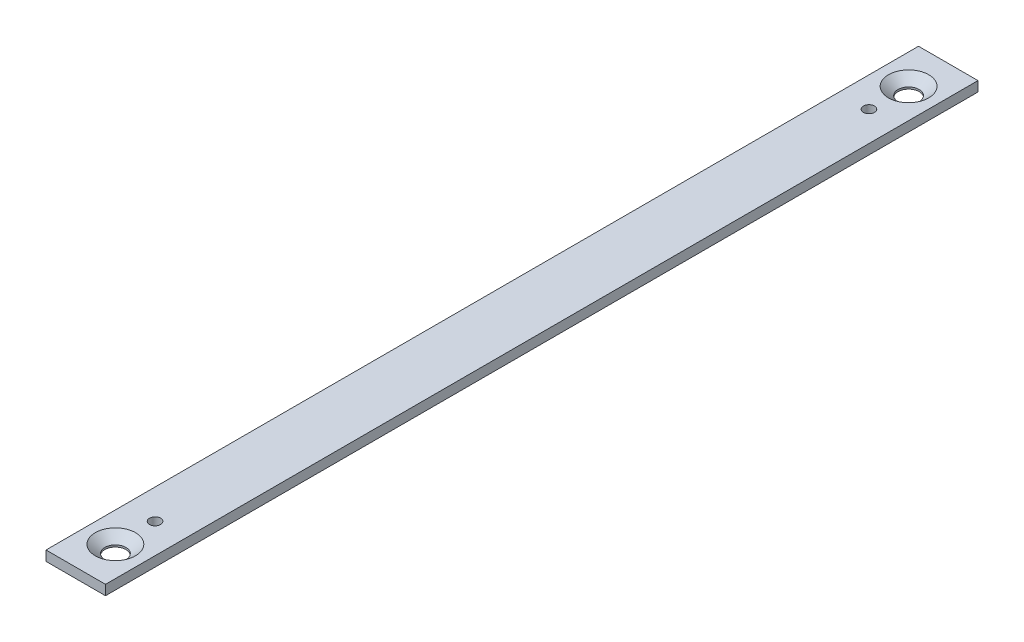
ISO-10303-21;
HEADER;
FILE_DESCRIPTION(('STEP AP214'),'2;1');
FILE_NAME('part.step','',(''),(''),'','','');
FILE_SCHEMA(('AUTOMOTIVE_DESIGN { 1 0 10303 214 1 1 1 1 }'));
ENDSEC;
DATA;
#1=APPLICATION_CONTEXT('core data for automotive mechanical design processes');
#2=APPLICATION_PROTOCOL_DEFINITION('international standard','automotive_design',2000,#1);
#3=PRODUCT_CONTEXT('',#1,'mechanical');
#4=PRODUCT('Part','Part','',(#3));
#5=PRODUCT_RELATED_PRODUCT_CATEGORY('part','',(#4));
#6=PRODUCT_DEFINITION_FORMATION('','',#4);
#7=PRODUCT_DEFINITION_CONTEXT('part definition',#1,'design');
#8=PRODUCT_DEFINITION('design','',#6,#7);
#9=PRODUCT_DEFINITION_SHAPE('','',#8);
#10=(LENGTH_UNIT() NAMED_UNIT(*) SI_UNIT(.MILLI.,.METRE.));
#11=(NAMED_UNIT(*) PLANE_ANGLE_UNIT() SI_UNIT($,.RADIAN.));
#12=(NAMED_UNIT(*) SI_UNIT($,.STERADIAN.) SOLID_ANGLE_UNIT());
#13=UNCERTAINTY_MEASURE_WITH_UNIT(LENGTH_MEASURE(1.E-05),#10,'distance_accuracy_value','');
#14=(GEOMETRIC_REPRESENTATION_CONTEXT(3) GLOBAL_UNCERTAINTY_ASSIGNED_CONTEXT((#13)) GLOBAL_UNIT_ASSIGNED_CONTEXT((#10,
#11,#12)) REPRESENTATION_CONTEXT('',''));
#15=CARTESIAN_POINT('',(0.,0.,0.));
#16=DIRECTION('',(0.,0.,1.));
#17=DIRECTION('',(1.,0.,0.));
#18=AXIS2_PLACEMENT_3D('',#15,#16,#17);
#19=CARTESIAN_POINT('',(9.525,-3.175,139.7));
#20=DIRECTION('',(1.,0.,0.));
#21=DIRECTION('',(0.,0.,-1.));
#22=AXIS2_PLACEMENT_3D('',#19,#20,#21);
#23=PLANE('',#22);
#24=DIRECTION('',(0.,0.,-1.));
#25=VECTOR('',#24,1.);
#26=CARTESIAN_POINT('',(9.525,0.,139.7));
#27=LINE('',#26,#25);
#28=CARTESIAN_POINT('',(9.525,0.,139.7));
#29=VERTEX_POINT('',#28);
#30=CARTESIAN_POINT('',(9.525,0.,-139.7));
#31=VERTEX_POINT('',#30);
#32=EDGE_CURVE('E98',#29,#31,#27,.T.);
#33=ORIENTED_EDGE('',*,*,#32,.F.);
#34=DIRECTION('',(0.,1.,0.));
#35=VECTOR('',#34,1.);
#36=CARTESIAN_POINT('',(9.525,-3.175,139.7));
#37=LINE('',#36,#35);
#38=CARTESIAN_POINT('',(9.525,-3.175,139.7));
#39=VERTEX_POINT('',#38);
#40=EDGE_CURVE('E11',#39,#29,#37,.T.);
#41=ORIENTED_EDGE('',*,*,#40,.F.);
#42=DIRECTION('',(0.,0.,-1.));
#43=VECTOR('',#42,1.);
#44=CARTESIAN_POINT('',(9.525,-3.175,139.7));
#45=LINE('',#44,#43);
#46=CARTESIAN_POINT('',(9.525,-3.175,-139.7));
#47=VERTEX_POINT('',#46);
#48=EDGE_CURVE('E91',#39,#47,#45,.T.);
#49=ORIENTED_EDGE('',*,*,#48,.T.);
#50=DIRECTION('',(0.,1.,0.));
#51=VECTOR('',#50,1.);
#52=CARTESIAN_POINT('',(9.525,-3.175,-139.7));
#53=LINE('',#52,#51);
#54=EDGE_CURVE('E36',#47,#31,#53,.T.);
#55=ORIENTED_EDGE('',*,*,#54,.T.);
#56=EDGE_LOOP('',(#33,#41,#49,#55));
#57=FACE_BOUND('',#56,.T.);
#58=ADVANCED_FACE('F33',(#57),#23,.T.);
#59=CARTESIAN_POINT('',(-9.52500000000001,-3.175,139.7));
#60=DIRECTION('',(0.,0.,1.));
#61=DIRECTION('',(1.,0.,0.));
#62=AXIS2_PLACEMENT_3D('',#59,#60,#61);
#63=PLANE('',#62);
#64=DIRECTION('',(1.,0.,0.));
#65=VECTOR('',#64,1.);
#66=CARTESIAN_POINT('',(-9.52500000000001,0.,139.7));
#67=LINE('',#66,#65);
#68=CARTESIAN_POINT('',(-9.52500000000001,0.,139.7));
#69=VERTEX_POINT('',#68);
#70=EDGE_CURVE('E93',#69,#29,#67,.T.);
#71=ORIENTED_EDGE('',*,*,#70,.F.);
#72=DIRECTION('',(0.,1.,0.));
#73=VECTOR('',#72,1.);
#74=CARTESIAN_POINT('',(-9.52500000000001,-3.175,139.7));
#75=LINE('',#74,#73);
#76=CARTESIAN_POINT('',(-9.52500000000001,-3.175,139.7));
#77=VERTEX_POINT('',#76);
#78=EDGE_CURVE('E42',#77,#69,#75,.T.);
#79=ORIENTED_EDGE('',*,*,#78,.F.);
#80=DIRECTION('',(1.,0.,0.));
#81=VECTOR('',#80,1.);
#82=CARTESIAN_POINT('',(-9.52500000000001,-3.175,139.7));
#83=LINE('',#82,#81);
#84=EDGE_CURVE('E88',#77,#39,#83,.T.);
#85=ORIENTED_EDGE('',*,*,#84,.T.);
#86=ORIENTED_EDGE('',*,*,#40,.T.);
#87=EDGE_LOOP('',(#71,#79,#85,#86));
#88=FACE_BOUND('',#87,.T.);
#89=ADVANCED_FACE('F109',(#88),#63,.T.);
#90=CARTESIAN_POINT('',(-9.52500000000001,-3.175,139.7));
#91=DIRECTION('',(-1.,0.,0.));
#92=DIRECTION('',(0.,0.,1.));
#93=AXIS2_PLACEMENT_3D('',#90,#91,#92);
#94=PLANE('',#93);
#95=DIRECTION('',(0.,0.,1.));
#96=VECTOR('',#95,1.);
#97=CARTESIAN_POINT('',(-9.52500000000001,0.,139.7));
#98=LINE('',#97,#96);
#99=CARTESIAN_POINT('',(-9.525,0.,-139.7));
#100=VERTEX_POINT('',#99);
#101=EDGE_CURVE('E83',#100,#69,#98,.T.);
#102=ORIENTED_EDGE('',*,*,#101,.F.);
#103=DIRECTION('',(0.,1.,0.));
#104=VECTOR('',#103,1.);
#105=CARTESIAN_POINT('',(-9.525,-3.175,-139.7));
#106=LINE('',#105,#104);
#107=CARTESIAN_POINT('',(-9.525,-3.175,-139.7));
#108=VERTEX_POINT('',#107);
#109=EDGE_CURVE('E78',#108,#100,#106,.T.);
#110=ORIENTED_EDGE('',*,*,#109,.F.);
#111=DIRECTION('',(0.,0.,1.));
#112=VECTOR('',#111,1.);
#113=CARTESIAN_POINT('',(-9.52500000000001,-3.175,139.7));
#114=LINE('',#113,#112);
#115=EDGE_CURVE('E81',#108,#77,#114,.T.);
#116=ORIENTED_EDGE('',*,*,#115,.T.);
#117=ORIENTED_EDGE('',*,*,#78,.T.);
#118=EDGE_LOOP('',(#102,#110,#116,#117));
#119=FACE_BOUND('',#118,.T.);
#120=ADVANCED_FACE('F80',(#119),#94,.T.);
#121=CARTESIAN_POINT('',(-9.525,-3.175,-139.7));
#122=DIRECTION('',(0.,0.,-1.));
#123=DIRECTION('',(-1.,0.,0.));
#124=AXIS2_PLACEMENT_3D('',#121,#122,#123);
#125=PLANE('',#124);
#126=DIRECTION('',(-1.,0.,0.));
#127=VECTOR('',#126,1.);
#128=CARTESIAN_POINT('',(-9.525,0.,-139.7));
#129=LINE('',#128,#127);
#130=EDGE_CURVE('E101',#31,#100,#129,.T.);
#131=ORIENTED_EDGE('',*,*,#130,.F.);
#132=ORIENTED_EDGE('',*,*,#54,.F.);
#133=DIRECTION('',(-1.,0.,0.));
#134=VECTOR('',#133,1.);
#135=CARTESIAN_POINT('',(-9.525,-3.175,-139.7));
#136=LINE('',#135,#134);
#137=EDGE_CURVE('E87',#47,#108,#136,.T.);
#138=ORIENTED_EDGE('',*,*,#137,.T.);
#139=ORIENTED_EDGE('',*,*,#109,.T.);
#140=EDGE_LOOP('',(#131,#132,#138,#139));
#141=FACE_BOUND('',#140,.T.);
#142=ADVANCED_FACE('F90',(#141),#125,.T.);
#143=CARTESIAN_POINT('',(0.,-3.175,0.));
#144=DIRECTION('',(0.,-1.,0.));
#145=DIRECTION('',(0.,0.,-1.));
#146=AXIS2_PLACEMENT_3D('',#143,#144,#145);
#147=PLANE('',#146);
#148=CARTESIAN_POINT('',(0.,-3.175,127.));
#149=DIRECTION('',(0.,1.,0.));
#150=DIRECTION('',(0.,0.,1.));
#151=AXIS2_PLACEMENT_3D('',#148,#149,#150);
#152=CIRCLE('',#151,3.3782);
#153=CARTESIAN_POINT('',(0.,-3.175,130.3782));
#154=VERTEX_POINT('',#153);
#155=EDGE_CURVE('E164',#154,#154,#152,.T.);
#156=ORIENTED_EDGE('',*,*,#155,.T.);
#157=EDGE_LOOP('',(#156));
#158=FACE_BOUND('',#157,.T.);
#159=CARTESIAN_POINT('',(0.,-3.175,-127.));
#160=DIRECTION('',(0.,1.,0.));
#161=DIRECTION('',(0.,0.,1.));
#162=AXIS2_PLACEMENT_3D('',#159,#160,#161);
#163=CIRCLE('',#162,3.3782);
#164=CARTESIAN_POINT('',(0.,-3.175,-123.6218));
#165=VERTEX_POINT('',#164);
#166=EDGE_CURVE('E174',#165,#165,#163,.T.);
#167=ORIENTED_EDGE('',*,*,#166,.T.);
#168=EDGE_LOOP('',(#167));
#169=FACE_BOUND('',#168,.T.);
#170=CARTESIAN_POINT('',(0.,-3.175,114.3));
#171=DIRECTION('',(0.,1.,0.));
#172=DIRECTION('',(0.,0.,1.));
#173=AXIS2_PLACEMENT_3D('',#170,#171,#172);
#174=CIRCLE('',#173,1.778);
#175=CARTESIAN_POINT('',(0.,-3.175,116.078));
#176=VERTEX_POINT('',#175);
#177=EDGE_CURVE('E178',#176,#176,#174,.T.);
#178=ORIENTED_EDGE('',*,*,#177,.T.);
#179=EDGE_LOOP('',(#178));
#180=FACE_BOUND('',#179,.T.);
#181=CARTESIAN_POINT('',(0.,-3.175,-114.3));
#182=DIRECTION('',(0.,1.,0.));
#183=DIRECTION('',(0.,0.,1.));
#184=AXIS2_PLACEMENT_3D('',#181,#182,#183);
#185=CIRCLE('',#184,1.778);
#186=CARTESIAN_POINT('',(0.,-3.175,-112.522));
#187=VERTEX_POINT('',#186);
#188=EDGE_CURVE('E102',#187,#187,#185,.T.);
#189=ORIENTED_EDGE('',*,*,#188,.T.);
#190=EDGE_LOOP('',(#189));
#191=FACE_BOUND('',#190,.T.);
#192=ORIENTED_EDGE('',*,*,#48,.F.);
#193=ORIENTED_EDGE('',*,*,#84,.F.);
#194=ORIENTED_EDGE('',*,*,#115,.F.);
#195=ORIENTED_EDGE('',*,*,#137,.F.);
#196=EDGE_LOOP('',(#192,#193,#194,#195));
#197=FACE_BOUND('',#196,.T.);
#198=ADVANCED_FACE('F86',(#158,#169,#180,#191,#197),#147,.T.);
#199=CARTESIAN_POINT('',(0.,0.,0.));
#200=DIRECTION('',(0.,-1.,0.));
#201=DIRECTION('',(0.,0.,-1.));
#202=AXIS2_PLACEMENT_3D('',#199,#200,#201);
#203=PLANE('',#202);
#204=CARTESIAN_POINT('',(0.,0.,127.));
#205=DIRECTION('',(0.,1.,0.));
#206=DIRECTION('',(0.,0.,1.));
#207=AXIS2_PLACEMENT_3D('',#204,#205,#206);
#208=CIRCLE('',#207,6.4389);
#209=CARTESIAN_POINT('',(0.,0.,133.4389));
#210=VERTEX_POINT('',#209);
#211=EDGE_CURVE('E162',#210,#210,#208,.T.);
#212=ORIENTED_EDGE('',*,*,#211,.F.);
#213=EDGE_LOOP('',(#212));
#214=FACE_BOUND('',#213,.T.);
#215=CARTESIAN_POINT('',(0.,0.,-127.));
#216=DIRECTION('',(0.,1.,0.));
#217=DIRECTION('',(0.,0.,1.));
#218=AXIS2_PLACEMENT_3D('',#215,#216,#217);
#219=CIRCLE('',#218,6.4389);
#220=CARTESIAN_POINT('',(0.,0.,-120.5611));
#221=VERTEX_POINT('',#220);
#222=EDGE_CURVE('E168',#221,#221,#219,.T.);
#223=ORIENTED_EDGE('',*,*,#222,.F.);
#224=EDGE_LOOP('',(#223));
#225=FACE_BOUND('',#224,.T.);
#226=CARTESIAN_POINT('',(0.,0.,114.3));
#227=DIRECTION('',(0.,1.,0.));
#228=DIRECTION('',(0.,0.,1.));
#229=AXIS2_PLACEMENT_3D('',#226,#227,#228);
#230=CIRCLE('',#229,1.778);
#231=CARTESIAN_POINT('',(0.,0.,116.078));
#232=VERTEX_POINT('',#231);
#233=EDGE_CURVE('E177',#232,#232,#230,.T.);
#234=ORIENTED_EDGE('',*,*,#233,.F.);
#235=EDGE_LOOP('',(#234));
#236=FACE_BOUND('',#235,.T.);
#237=CARTESIAN_POINT('',(0.,0.,-114.3));
#238=DIRECTION('',(0.,1.,0.));
#239=DIRECTION('',(0.,0.,1.));
#240=AXIS2_PLACEMENT_3D('',#237,#238,#239);
#241=CIRCLE('',#240,1.778);
#242=CARTESIAN_POINT('',(0.,0.,-112.522));
#243=VERTEX_POINT('',#242);
#244=EDGE_CURVE('E181',#243,#243,#241,.T.);
#245=ORIENTED_EDGE('',*,*,#244,.F.);
#246=EDGE_LOOP('',(#245));
#247=FACE_BOUND('',#246,.T.);
#248=ORIENTED_EDGE('',*,*,#32,.T.);
#249=ORIENTED_EDGE('',*,*,#130,.T.);
#250=ORIENTED_EDGE('',*,*,#101,.T.);
#251=ORIENTED_EDGE('',*,*,#70,.T.);
#252=EDGE_LOOP('',(#248,#249,#250,#251));
#253=FACE_BOUND('',#252,.T.);
#254=ADVANCED_FACE('F108',(#214,#225,#236,#247,#253),#203,.F.);
#255=CARTESIAN_POINT('',(0.,-3.175,-114.3));
#256=DIRECTION('',(0.,1.,0.));
#257=DIRECTION('',(0.,0.,1.));
#258=AXIS2_PLACEMENT_3D('',#255,#256,#257);
#259=CYLINDRICAL_SURFACE('',#258,1.778);
#260=ORIENTED_EDGE('',*,*,#188,.F.);
#261=EDGE_LOOP('',(#260));
#262=FACE_BOUND('',#261,.T.);
#263=ORIENTED_EDGE('',*,*,#244,.T.);
#264=EDGE_LOOP('',(#263));
#265=FACE_BOUND('',#264,.T.);
#266=ADVANCED_FACE('F127',(#262,#265),#259,.F.);
#267=CARTESIAN_POINT('',(0.,-3.175,114.3));
#268=DIRECTION('',(0.,1.,0.));
#269=DIRECTION('',(0.,0.,1.));
#270=AXIS2_PLACEMENT_3D('',#267,#268,#269);
#271=CYLINDRICAL_SURFACE('',#270,1.778);
#272=ORIENTED_EDGE('',*,*,#177,.F.);
#273=EDGE_LOOP('',(#272));
#274=FACE_BOUND('',#273,.T.);
#275=ORIENTED_EDGE('',*,*,#233,.T.);
#276=EDGE_LOOP('',(#275));
#277=FACE_BOUND('',#276,.T.);
#278=ADVANCED_FACE('F134',(#274,#277),#271,.F.);
#279=CARTESIAN_POINT('',(0.,0.,-127.));
#280=DIRECTION('',(0.,1.,0.));
#281=DIRECTION('',(0.,0.,1.));
#282=AXIS2_PLACEMENT_3D('',#279,#280,#281);
#283=CYLINDRICAL_SURFACE('',#282,3.3782);
#284=ORIENTED_EDGE('',*,*,#166,.F.);
#285=EDGE_LOOP('',(#284));
#286=FACE_BOUND('',#285,.T.);
#287=CARTESIAN_POINT('',(0.,-2.5682322411443,-127.));
#288=DIRECTION('',(0.,1.,0.));
#289=DIRECTION('',(0.,0.,1.));
#290=AXIS2_PLACEMENT_3D('',#287,#288,#289);
#291=CIRCLE('',#290,3.3782);
#292=CARTESIAN_POINT('',(0.,-2.5682322411443,-123.6218));
#293=VERTEX_POINT('',#292);
#294=EDGE_CURVE('E171',#293,#293,#291,.T.);
#295=ORIENTED_EDGE('',*,*,#294,.T.);
#296=EDGE_LOOP('',(#295));
#297=FACE_BOUND('',#296,.T.);
#298=ADVANCED_FACE('F138',(#286,#297),#283,.F.);
#299=CARTESIAN_POINT('',(0.,0.,-127.));
#300=DIRECTION('',(0.,1.,0.));
#301=DIRECTION('',(0.,0.,1.));
#302=AXIS2_PLACEMENT_3D('',#299,#300,#301);
#303=CONICAL_SURFACE('',#302,6.4389,0.872664625997165);
#304=ORIENTED_EDGE('',*,*,#294,.F.);
#305=EDGE_LOOP('',(#304));
#306=FACE_BOUND('',#305,.T.);
#307=ORIENTED_EDGE('',*,*,#222,.T.);
#308=EDGE_LOOP('',(#307));
#309=FACE_BOUND('',#308,.T.);
#310=ADVANCED_FACE('F142',(#306,#309),#303,.F.);
#311=CARTESIAN_POINT('',(0.,0.,127.));
#312=DIRECTION('',(0.,1.,0.));
#313=DIRECTION('',(0.,0.,1.));
#314=AXIS2_PLACEMENT_3D('',#311,#312,#313);
#315=CYLINDRICAL_SURFACE('',#314,3.3782);
#316=ORIENTED_EDGE('',*,*,#155,.F.);
#317=EDGE_LOOP('',(#316));
#318=FACE_BOUND('',#317,.T.);
#319=CARTESIAN_POINT('',(0.,-2.5682322411443,127.));
#320=DIRECTION('',(0.,1.,0.));
#321=DIRECTION('',(0.,0.,1.));
#322=AXIS2_PLACEMENT_3D('',#319,#320,#321);
#323=CIRCLE('',#322,3.3782);
#324=CARTESIAN_POINT('',(0.,-2.5682322411443,130.3782));
#325=VERTEX_POINT('',#324);
#326=EDGE_CURVE('E159',#325,#325,#323,.T.);
#327=ORIENTED_EDGE('',*,*,#326,.T.);
#328=EDGE_LOOP('',(#327));
#329=FACE_BOUND('',#328,.T.);
#330=ADVANCED_FACE('F146',(#318,#329),#315,.F.);
#331=CARTESIAN_POINT('',(0.,0.,127.));
#332=DIRECTION('',(0.,1.,0.));
#333=DIRECTION('',(0.,0.,1.));
#334=AXIS2_PLACEMENT_3D('',#331,#332,#333);
#335=CONICAL_SURFACE('',#334,6.4389,0.872664625997165);
#336=ORIENTED_EDGE('',*,*,#326,.F.);
#337=EDGE_LOOP('',(#336));
#338=FACE_BOUND('',#337,.T.);
#339=ORIENTED_EDGE('',*,*,#211,.T.);
#340=EDGE_LOOP('',(#339));
#341=FACE_BOUND('',#340,.T.);
#342=ADVANCED_FACE('F150',(#338,#341),#335,.F.);
#343=CLOSED_SHELL('',(#58,#89,#120,#142,#198,#254,#266,#278,#298,#310,#330,#342));
#344=MANIFOLD_SOLID_BREP('B2',#343);
#345=ADVANCED_BREP_SHAPE_REPRESENTATION('',(#18,#344),#14);
#346=SHAPE_DEFINITION_REPRESENTATION(#9,#345);
ENDSEC;
END-ISO-10303-21;
